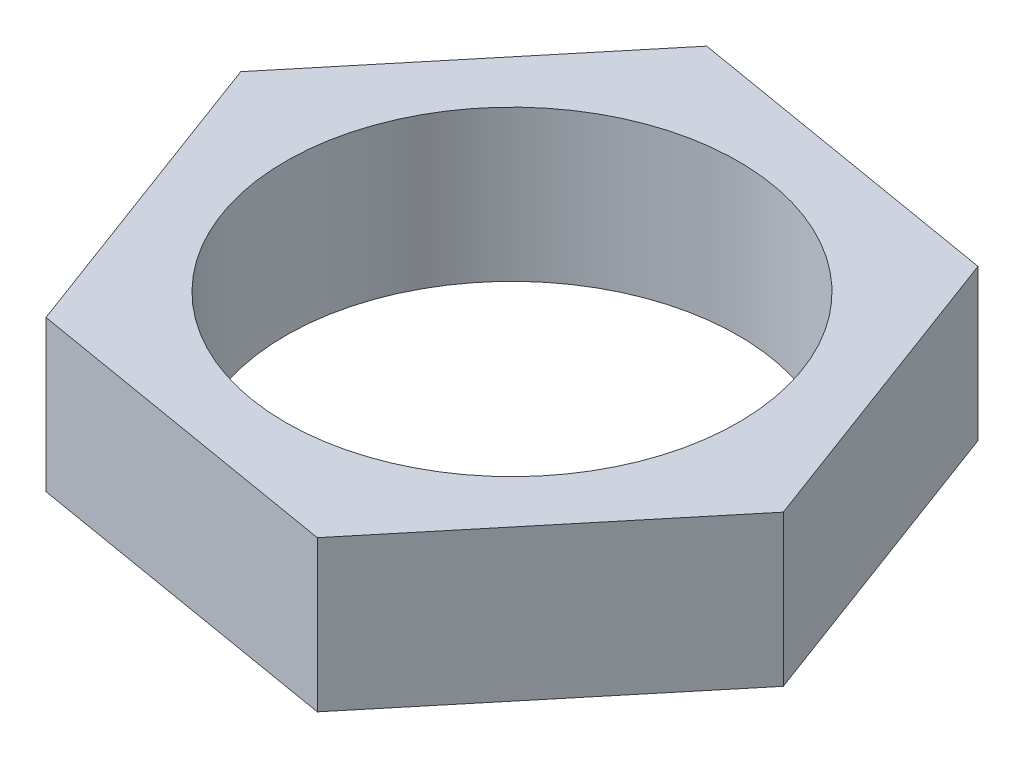
ISO-10303-21;
HEADER;
FILE_DESCRIPTION(('STEP AP214'),'2;1');
FILE_NAME('part.step','',(''),(''),'','','');
FILE_SCHEMA(('AUTOMOTIVE_DESIGN { 1 0 10303 214 1 1 1 1 }'));
ENDSEC;
DATA;
#1=APPLICATION_CONTEXT('core data for automotive mechanical design processes');
#2=APPLICATION_PROTOCOL_DEFINITION('international standard','automotive_design',2000,#1);
#3=PRODUCT_CONTEXT('',#1,'mechanical');
#4=PRODUCT('Part','Part','',(#3));
#5=PRODUCT_RELATED_PRODUCT_CATEGORY('part','',(#4));
#6=PRODUCT_DEFINITION_FORMATION('','',#4);
#7=PRODUCT_DEFINITION_CONTEXT('part definition',#1,'design');
#8=PRODUCT_DEFINITION('design','',#6,#7);
#9=PRODUCT_DEFINITION_SHAPE('','',#8);
#10=(LENGTH_UNIT() NAMED_UNIT(*) SI_UNIT(.MILLI.,.METRE.));
#11=(NAMED_UNIT(*) PLANE_ANGLE_UNIT() SI_UNIT($,.RADIAN.));
#12=(NAMED_UNIT(*) SI_UNIT($,.STERADIAN.) SOLID_ANGLE_UNIT());
#13=UNCERTAINTY_MEASURE_WITH_UNIT(LENGTH_MEASURE(1.E-05),#10,'distance_accuracy_value','');
#14=(GEOMETRIC_REPRESENTATION_CONTEXT(3) GLOBAL_UNCERTAINTY_ASSIGNED_CONTEXT((#13)) GLOBAL_UNIT_ASSIGNED_CONTEXT((#10,
#11,#12)) REPRESENTATION_CONTEXT('',''));
#15=CARTESIAN_POINT('',(0.,0.,0.));
#16=DIRECTION('',(0.,0.,1.));
#17=DIRECTION('',(1.,0.,0.));
#18=AXIS2_PLACEMENT_3D('',#15,#16,#17);
#19=CARTESIAN_POINT('',(0.,5.,0.));
#20=DIRECTION('',(0.,1.,0.));
#21=DIRECTION('',(0.,0.,1.));
#22=AXIS2_PLACEMENT_3D('',#19,#20,#21);
#23=PLANE('',#22);
#24=DIRECTION('',(-0.637133776127123,0.,0.770753236333129));
#25=VECTOR('',#24,1.);
#26=CARTESIAN_POINT('',(-3.82758685217516,5.,-10.2802194637269));
#27=LINE('',#26,#25);
#28=CARTESIAN_POINT('',(-3.82758685217516,5.,-10.2802194637269));
#29=VERTEX_POINT('',#28);
#30=CARTESIAN_POINT('',(-10.8167246381543,5.,-1.82532228268847));
#31=VERTEX_POINT('',#30);
#32=EDGE_CURVE('E150',#29,#31,#27,.T.);
#33=ORIENTED_EDGE('',*,*,#32,.T.);
#34=DIRECTION('',(0.348924994649999,0.,0.937150653901761));
#35=VECTOR('',#34,1.);
#36=CARTESIAN_POINT('',(-10.8167246381543,5.,-1.82532228268847));
#37=LINE('',#36,#35);
#38=CARTESIAN_POINT('',(-6.98913778597914,5.,8.45489718103845));
#39=VERTEX_POINT('',#38);
#40=EDGE_CURVE('E98',#31,#39,#37,.T.);
#41=ORIENTED_EDGE('',*,*,#40,.T.);
#42=DIRECTION('',(0.986058770777123,0.,0.16639741756863));
#43=VECTOR('',#42,1.);
#44=CARTESIAN_POINT('',(-6.98913778597914,5.,8.45489718103845));
#45=LINE('',#44,#43);
#46=CARTESIAN_POINT('',(3.82758685217516,5.,10.2802194637269));
#47=VERTEX_POINT('',#46);
#48=EDGE_CURVE('E111',#39,#47,#45,.T.);
#49=ORIENTED_EDGE('',*,*,#48,.T.);
#50=DIRECTION('',(0.637133776127123,0.,-0.77075323633313));
#51=VECTOR('',#50,1.);
#52=CARTESIAN_POINT('',(3.82758685217516,5.,10.2802194637269));
#53=LINE('',#52,#51);
#54=CARTESIAN_POINT('',(10.8167246381543,5.,1.82532228268845));
#55=VERTEX_POINT('',#54);
#56=EDGE_CURVE('E105',#47,#55,#53,.T.);
#57=ORIENTED_EDGE('',*,*,#56,.T.);
#58=DIRECTION('',(-0.348924994649999,0.,-0.937150653901761));
#59=VECTOR('',#58,1.);
#60=CARTESIAN_POINT('',(10.8167246381543,5.,1.82532228268845));
#61=LINE('',#60,#59);
#62=CARTESIAN_POINT('',(6.98913778597915,5.,-8.45489718103844));
#63=VERTEX_POINT('',#62);
#64=EDGE_CURVE('E109',#55,#63,#61,.T.);
#65=ORIENTED_EDGE('',*,*,#64,.T.);
#66=DIRECTION('',(-0.986058770777123,0.,-0.166397417568631));
#67=VECTOR('',#66,1.);
#68=CARTESIAN_POINT('',(6.98913778597915,5.,-8.45489718103844));
#69=LINE('',#68,#67);
#70=EDGE_CURVE('E61',#63,#29,#69,.T.);
#71=ORIENTED_EDGE('',*,*,#70,.T.);
#72=EDGE_LOOP('',(#33,#41,#49,#57,#65,#71));
#73=FACE_BOUND('',#72,.T.);
#74=CARTESIAN_POINT('',(0.,5.,0.));
#75=DIRECTION('',(0.,1.,0.));
#76=DIRECTION('',(0.,0.,1.));
#77=AXIS2_PLACEMENT_3D('',#74,#75,#76);
#78=CIRCLE('',#77,7.5);
#79=CARTESIAN_POINT('',(0.,5.,7.5));
#80=VERTEX_POINT('',#79);
#81=EDGE_CURVE('E138',#80,#80,#78,.T.);
#82=ORIENTED_EDGE('',*,*,#81,.F.);
#83=EDGE_LOOP('',(#82));
#84=FACE_BOUND('',#83,.T.);
#85=ADVANCED_FACE('F43',(#73,#84),#23,.T.);
#86=CARTESIAN_POINT('',(0.,0.,0.));
#87=DIRECTION('',(0.,1.,0.));
#88=DIRECTION('',(0.,0.,1.));
#89=AXIS2_PLACEMENT_3D('',#86,#87,#88);
#90=PLANE('',#89);
#91=DIRECTION('',(-0.637133776127123,0.,0.770753236333129));
#92=VECTOR('',#91,1.);
#93=CARTESIAN_POINT('',(-3.82758685217516,0.,-10.2802194637269));
#94=LINE('',#93,#92);
#95=CARTESIAN_POINT('',(-3.82758685217516,0.,-10.2802194637269));
#96=VERTEX_POINT('',#95);
#97=CARTESIAN_POINT('',(-10.8167246381543,0.,-1.82532228268847));
#98=VERTEX_POINT('',#97);
#99=EDGE_CURVE('E133',#96,#98,#94,.T.);
#100=ORIENTED_EDGE('',*,*,#99,.F.);
#101=DIRECTION('',(-0.986058770777123,0.,-0.166397417568631));
#102=VECTOR('',#101,1.);
#103=CARTESIAN_POINT('',(6.98913778597915,0.,-8.45489718103844));
#104=LINE('',#103,#102);
#105=CARTESIAN_POINT('',(6.98913778597915,0.,-8.45489718103844));
#106=VERTEX_POINT('',#105);
#107=EDGE_CURVE('E90',#106,#96,#104,.T.);
#108=ORIENTED_EDGE('',*,*,#107,.F.);
#109=DIRECTION('',(-0.348924994649999,0.,-0.937150653901761));
#110=VECTOR('',#109,1.);
#111=CARTESIAN_POINT('',(10.8167246381543,0.,1.82532228268845));
#112=LINE('',#111,#110);
#113=CARTESIAN_POINT('',(10.8167246381543,0.,1.82532228268845));
#114=VERTEX_POINT('',#113);
#115=EDGE_CURVE('E84',#114,#106,#112,.T.);
#116=ORIENTED_EDGE('',*,*,#115,.F.);
#117=DIRECTION('',(0.637133776127123,0.,-0.77075323633313));
#118=VECTOR('',#117,1.);
#119=CARTESIAN_POINT('',(3.82758685217516,0.,10.2802194637269));
#120=LINE('',#119,#118);
#121=CARTESIAN_POINT('',(3.82758685217516,0.,10.2802194637269));
#122=VERTEX_POINT('',#121);
#123=EDGE_CURVE('E120',#122,#114,#120,.T.);
#124=ORIENTED_EDGE('',*,*,#123,.F.);
#125=DIRECTION('',(0.986058770777123,0.,0.16639741756863));
#126=VECTOR('',#125,1.);
#127=CARTESIAN_POINT('',(-6.98913778597914,0.,8.45489718103845));
#128=LINE('',#127,#126);
#129=CARTESIAN_POINT('',(-6.98913778597914,0.,8.45489718103845));
#130=VERTEX_POINT('',#129);
#131=EDGE_CURVE('E141',#130,#122,#128,.T.);
#132=ORIENTED_EDGE('',*,*,#131,.F.);
#133=DIRECTION('',(0.348924994649999,0.,0.937150653901761));
#134=VECTOR('',#133,1.);
#135=CARTESIAN_POINT('',(-10.8167246381543,0.,-1.82532228268847));
#136=LINE('',#135,#134);
#137=EDGE_CURVE('E137',#98,#130,#136,.T.);
#138=ORIENTED_EDGE('',*,*,#137,.F.);
#139=EDGE_LOOP('',(#100,#108,#116,#124,#132,#138));
#140=FACE_BOUND('',#139,.T.);
#141=CARTESIAN_POINT('',(0.,0.,0.));
#142=DIRECTION('',(0.,1.,0.));
#143=DIRECTION('',(0.,0.,1.));
#144=AXIS2_PLACEMENT_3D('',#141,#142,#143);
#145=CIRCLE('',#144,7.5);
#146=CARTESIAN_POINT('',(0.,0.,7.5));
#147=VERTEX_POINT('',#146);
#148=EDGE_CURVE('E265',#147,#147,#145,.T.);
#149=ORIENTED_EDGE('',*,*,#148,.T.);
#150=EDGE_LOOP('',(#149));
#151=FACE_BOUND('',#150,.T.);
#152=ADVANCED_FACE('F163',(#140,#151),#90,.F.);
#153=CARTESIAN_POINT('',(-3.82758685217516,5.,-10.2802194637269));
#154=DIRECTION('',(0.770753236333129,0.,0.637133776127124));
#155=DIRECTION('',(0.637133776127124,0.,-0.770753236333129));
#156=AXIS2_PLACEMENT_3D('',#153,#154,#155);
#157=PLANE('',#156);
#158=ORIENTED_EDGE('',*,*,#99,.T.);
#159=DIRECTION('',(0.,-1.,0.));
#160=VECTOR('',#159,1.);
#161=CARTESIAN_POINT('',(-10.8167246381543,5.,-1.82532228268847));
#162=LINE('',#161,#160);
#163=EDGE_CURVE('E11',#31,#98,#162,.T.);
#164=ORIENTED_EDGE('',*,*,#163,.F.);
#165=ORIENTED_EDGE('',*,*,#32,.F.);
#166=DIRECTION('',(0.,-1.,0.));
#167=VECTOR('',#166,1.);
#168=CARTESIAN_POINT('',(-3.82758685217516,5.,-10.2802194637269));
#169=LINE('',#168,#167);
#170=EDGE_CURVE('E129',#29,#96,#169,.T.);
#171=ORIENTED_EDGE('',*,*,#170,.T.);
#172=EDGE_LOOP('',(#158,#164,#165,#171));
#173=FACE_BOUND('',#172,.T.);
#174=ADVANCED_FACE('F45',(#173),#157,.F.);
#175=CARTESIAN_POINT('',(-10.8167246381543,5.,-1.82532228268847));
#176=DIRECTION('',(0.937150653901761,0.,-0.348924994649999));
#177=DIRECTION('',(-0.348924994649999,0.,-0.937150653901761));
#178=AXIS2_PLACEMENT_3D('',#175,#176,#177);
#179=PLANE('',#178);
#180=ORIENTED_EDGE('',*,*,#137,.T.);
#181=DIRECTION('',(0.,-1.,0.));
#182=VECTOR('',#181,1.);
#183=CARTESIAN_POINT('',(-6.98913778597914,5.,8.45489718103845));
#184=LINE('',#183,#182);
#185=EDGE_CURVE('E53',#39,#130,#184,.T.);
#186=ORIENTED_EDGE('',*,*,#185,.F.);
#187=ORIENTED_EDGE('',*,*,#40,.F.);
#188=ORIENTED_EDGE('',*,*,#163,.T.);
#189=EDGE_LOOP('',(#180,#186,#187,#188));
#190=FACE_BOUND('',#189,.T.);
#191=ADVANCED_FACE('F188',(#190),#179,.F.);
#192=CARTESIAN_POINT('',(-6.98913778597914,5.,8.45489718103845));
#193=DIRECTION('',(0.16639741756863,0.,-0.986058770777123));
#194=DIRECTION('',(-0.986058770777123,0.,-0.16639741756863));
#195=AXIS2_PLACEMENT_3D('',#192,#193,#194);
#196=PLANE('',#195);
#197=ORIENTED_EDGE('',*,*,#131,.T.);
#198=DIRECTION('',(0.,-1.,0.));
#199=VECTOR('',#198,1.);
#200=CARTESIAN_POINT('',(3.82758685217516,5.,10.2802194637269));
#201=LINE('',#200,#199);
#202=EDGE_CURVE('E122',#47,#122,#201,.T.);
#203=ORIENTED_EDGE('',*,*,#202,.F.);
#204=ORIENTED_EDGE('',*,*,#48,.F.);
#205=ORIENTED_EDGE('',*,*,#185,.T.);
#206=EDGE_LOOP('',(#197,#203,#204,#205));
#207=FACE_BOUND('',#206,.T.);
#208=ADVANCED_FACE('F160',(#207),#196,.F.);
#209=CARTESIAN_POINT('',(3.82758685217516,5.,10.2802194637269));
#210=DIRECTION('',(-0.77075323633313,0.,-0.637133776127123));
#211=DIRECTION('',(-0.637133776127123,0.,0.77075323633313));
#212=AXIS2_PLACEMENT_3D('',#209,#210,#211);
#213=PLANE('',#212);
#214=ORIENTED_EDGE('',*,*,#123,.T.);
#215=DIRECTION('',(0.,-1.,0.));
#216=VECTOR('',#215,1.);
#217=CARTESIAN_POINT('',(10.8167246381543,5.,1.82532228268845));
#218=LINE('',#217,#216);
#219=EDGE_CURVE('E117',#55,#114,#218,.T.);
#220=ORIENTED_EDGE('',*,*,#219,.F.);
#221=ORIENTED_EDGE('',*,*,#56,.F.);
#222=ORIENTED_EDGE('',*,*,#202,.T.);
#223=EDGE_LOOP('',(#214,#220,#221,#222));
#224=FACE_BOUND('',#223,.T.);
#225=ADVANCED_FACE('F118',(#224),#213,.F.);
#226=CARTESIAN_POINT('',(10.8167246381543,5.,1.82532228268845));
#227=DIRECTION('',(-0.937150653901761,0.,0.348924994649999));
#228=DIRECTION('',(0.348924994649999,0.,0.937150653901761));
#229=AXIS2_PLACEMENT_3D('',#226,#227,#228);
#230=PLANE('',#229);
#231=ORIENTED_EDGE('',*,*,#115,.T.);
#232=DIRECTION('',(0.,-1.,0.));
#233=VECTOR('',#232,1.);
#234=CARTESIAN_POINT('',(6.98913778597915,5.,-8.45489718103844));
#235=LINE('',#234,#233);
#236=EDGE_CURVE('E123',#63,#106,#235,.T.);
#237=ORIENTED_EDGE('',*,*,#236,.F.);
#238=ORIENTED_EDGE('',*,*,#64,.F.);
#239=ORIENTED_EDGE('',*,*,#219,.T.);
#240=EDGE_LOOP('',(#231,#237,#238,#239));
#241=FACE_BOUND('',#240,.T.);
#242=ADVANCED_FACE('F125',(#241),#230,.F.);
#243=CARTESIAN_POINT('',(6.98913778597915,5.,-8.45489718103844));
#244=DIRECTION('',(-0.166397417568631,0.,0.986058770777123));
#245=DIRECTION('',(0.986058770777123,0.,0.166397417568631));
#246=AXIS2_PLACEMENT_3D('',#243,#244,#245);
#247=PLANE('',#246);
#248=ORIENTED_EDGE('',*,*,#107,.T.);
#249=ORIENTED_EDGE('',*,*,#170,.F.);
#250=ORIENTED_EDGE('',*,*,#70,.F.);
#251=ORIENTED_EDGE('',*,*,#236,.T.);
#252=EDGE_LOOP('',(#248,#249,#250,#251));
#253=FACE_BOUND('',#252,.T.);
#254=ADVANCED_FACE('F168',(#253),#247,.F.);
#255=CARTESIAN_POINT('',(0.,5.,0.));
#256=DIRECTION('',(0.,-1.,0.));
#257=DIRECTION('',(0.,0.,-1.));
#258=AXIS2_PLACEMENT_3D('',#255,#256,#257);
#259=CYLINDRICAL_SURFACE('',#258,7.5);
#260=ORIENTED_EDGE('',*,*,#81,.T.);
#261=EDGE_LOOP('',(#260));
#262=FACE_BOUND('',#261,.T.);
#263=ORIENTED_EDGE('',*,*,#148,.F.);
#264=EDGE_LOOP('',(#263));
#265=FACE_BOUND('',#264,.T.);
#266=ADVANCED_FACE('F170',(#262,#265),#259,.F.);
#267=CLOSED_SHELL('',(#85,#152,#174,#191,#208,#225,#242,#254,#266));
#268=MANIFOLD_SOLID_BREP('B2',#267);
#269=ADVANCED_BREP_SHAPE_REPRESENTATION('',(#18,#268),#14);
#270=SHAPE_DEFINITION_REPRESENTATION(#9,#269);
ENDSEC;
END-ISO-10303-21;
